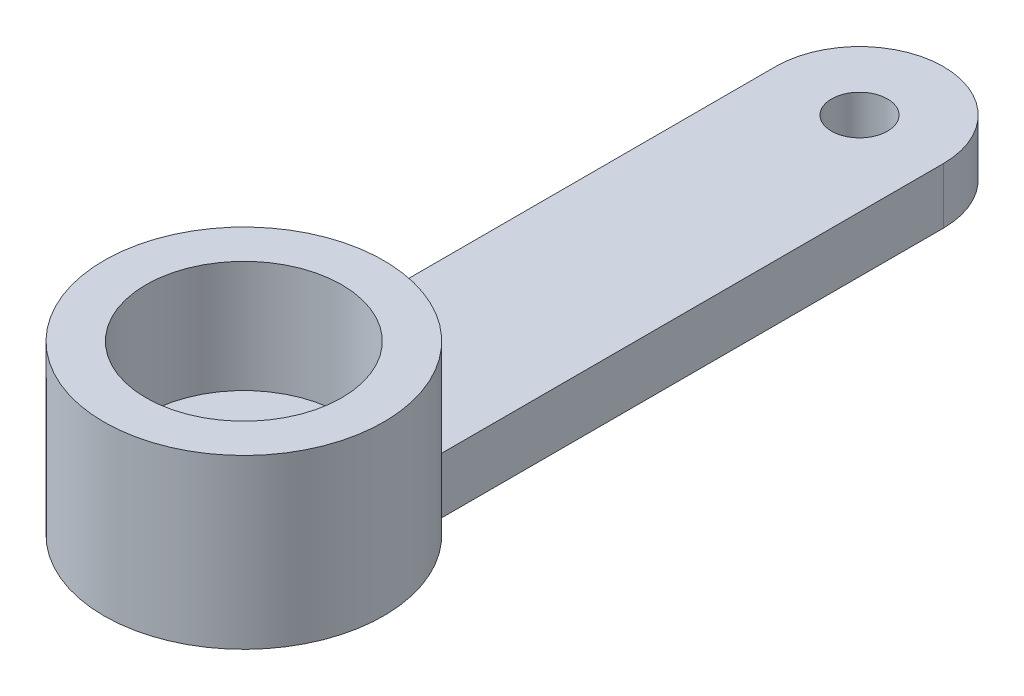
ISO-10303-21;
HEADER;
FILE_DESCRIPTION(('STEP AP214'),'2;1');
FILE_NAME('part.step','',(''),(''),'','','');
FILE_SCHEMA(('AUTOMOTIVE_DESIGN { 1 0 10303 214 1 1 1 1 }'));
ENDSEC;
DATA;
#1=APPLICATION_CONTEXT('core data for automotive mechanical design processes');
#2=APPLICATION_PROTOCOL_DEFINITION('international standard','automotive_design',2000,#1);
#3=PRODUCT_CONTEXT('',#1,'mechanical');
#4=PRODUCT('Part','Part','',(#3));
#5=PRODUCT_RELATED_PRODUCT_CATEGORY('part','',(#4));
#6=PRODUCT_DEFINITION_FORMATION('','',#4);
#7=PRODUCT_DEFINITION_CONTEXT('part definition',#1,'design');
#8=PRODUCT_DEFINITION('design','',#6,#7);
#9=PRODUCT_DEFINITION_SHAPE('','',#8);
#10=(LENGTH_UNIT() NAMED_UNIT(*) SI_UNIT(.MILLI.,.METRE.));
#11=(NAMED_UNIT(*) PLANE_ANGLE_UNIT() SI_UNIT($,.RADIAN.));
#12=(NAMED_UNIT(*) SI_UNIT($,.STERADIAN.) SOLID_ANGLE_UNIT());
#13=UNCERTAINTY_MEASURE_WITH_UNIT(LENGTH_MEASURE(1.E-05),#10,'distance_accuracy_value','');
#14=(GEOMETRIC_REPRESENTATION_CONTEXT(3) GLOBAL_UNCERTAINTY_ASSIGNED_CONTEXT((#13)) GLOBAL_UNIT_ASSIGNED_CONTEXT((#10,
#11,#12)) REPRESENTATION_CONTEXT('',''));
#15=CARTESIAN_POINT('',(0.,0.,0.));
#16=DIRECTION('',(0.,0.,1.));
#17=DIRECTION('',(1.,0.,0.));
#18=AXIS2_PLACEMENT_3D('',#15,#16,#17);
#19=CARTESIAN_POINT('',(0.,1.,-11.));
#20=DIRECTION('',(0.,-1.,0.));
#21=DIRECTION('',(0.,0.,-1.));
#22=AXIS2_PLACEMENT_3D('',#19,#20,#21);
#23=CYLINDRICAL_SURFACE('',#22,1.5);
#24=CARTESIAN_POINT('',(0.,0.,-11.));
#25=DIRECTION('',(0.,1.,0.));
#26=DIRECTION('',(0.,0.,1.));
#27=AXIS2_PLACEMENT_3D('',#24,#25,#26);
#28=CIRCLE('',#27,1.5);
#29=CARTESIAN_POINT('',(-1.5,0.,-11.));
#30=VERTEX_POINT('',#29);
#31=CARTESIAN_POINT('',(1.5,0.,-11.));
#32=VERTEX_POINT('',#31);
#33=EDGE_CURVE('E109',#30,#32,#28,.F.);
#34=ORIENTED_EDGE('',*,*,#33,.F.);
#35=DIRECTION('',(0.,-1.,0.));
#36=VECTOR('',#35,1.);
#37=CARTESIAN_POINT('',(-1.5,1.,-11.));
#38=LINE('',#37,#36);
#39=CARTESIAN_POINT('',(-1.5,1.,-11.));
#40=VERTEX_POINT('',#39);
#41=EDGE_CURVE('E11',#40,#30,#38,.T.);
#42=ORIENTED_EDGE('',*,*,#41,.F.);
#43=CARTESIAN_POINT('',(0.,1.,-11.));
#44=DIRECTION('',(0.,1.,0.));
#45=DIRECTION('',(0.,0.,1.));
#46=AXIS2_PLACEMENT_3D('',#43,#44,#45);
#47=CIRCLE('',#46,1.5);
#48=CARTESIAN_POINT('',(1.5,1.,-11.));
#49=VERTEX_POINT('',#48);
#50=EDGE_CURVE('E116',#40,#49,#47,.F.);
#51=ORIENTED_EDGE('',*,*,#50,.T.);
#52=DIRECTION('',(0.,-1.,0.));
#53=VECTOR('',#52,1.);
#54=CARTESIAN_POINT('',(1.5,1.,-11.));
#55=LINE('',#54,#53);
#56=EDGE_CURVE('E58',#49,#32,#55,.T.);
#57=ORIENTED_EDGE('',*,*,#56,.T.);
#58=EDGE_LOOP('',(#34,#42,#51,#57));
#59=FACE_BOUND('',#58,.T.);
#60=ADVANCED_FACE('F41',(#59),#23,.T.);
#61=CARTESIAN_POINT('',(-1.5,1.,0.));
#62=DIRECTION('',(-1.,0.,0.));
#63=DIRECTION('',(0.,0.,1.));
#64=AXIS2_PLACEMENT_3D('',#61,#62,#63);
#65=PLANE('',#64);
#66=DIRECTION('',(0.,0.,-1.));
#67=VECTOR('',#66,1.);
#68=CARTESIAN_POINT('',(-1.5,0.,0.));
#69=LINE('',#68,#67);
#70=CARTESIAN_POINT('',(-1.5,0.,-2.));
#71=VERTEX_POINT('',#70);
#72=EDGE_CURVE('E124',#71,#30,#69,.T.);
#73=ORIENTED_EDGE('',*,*,#72,.F.);
#74=DIRECTION('',(0.,-1.,0.));
#75=VECTOR('',#74,1.);
#76=CARTESIAN_POINT('',(-1.5,1.,-2.));
#77=LINE('',#76,#75);
#78=CARTESIAN_POINT('',(-1.5,1.,-2.));
#79=VERTEX_POINT('',#78);
#80=EDGE_CURVE('E50',#79,#71,#77,.T.);
#81=ORIENTED_EDGE('',*,*,#80,.F.);
#82=DIRECTION('',(0.,0.,-1.));
#83=VECTOR('',#82,1.);
#84=CARTESIAN_POINT('',(-1.5,1.,0.));
#85=LINE('',#84,#83);
#86=EDGE_CURVE('E87',#79,#40,#85,.T.);
#87=ORIENTED_EDGE('',*,*,#86,.T.);
#88=ORIENTED_EDGE('',*,*,#41,.T.);
#89=EDGE_LOOP('',(#73,#81,#87,#88));
#90=FACE_BOUND('',#89,.T.);
#91=ADVANCED_FACE('F138',(#90),#65,.T.);
#92=CARTESIAN_POINT('',(0.,1.,0.));
#93=DIRECTION('',(0.,-1.,0.));
#94=DIRECTION('',(0.,0.,-1.));
#95=AXIS2_PLACEMENT_3D('',#92,#93,#94);
#96=CYLINDRICAL_SURFACE('',#95,2.5);
#97=CARTESIAN_POINT('',(0.,0.,0.));
#98=DIRECTION('',(0.,1.,0.));
#99=DIRECTION('',(0.,0.,1.));
#100=AXIS2_PLACEMENT_3D('',#97,#98,#99);
#101=CIRCLE('',#100,2.5);
#102=CARTESIAN_POINT('',(1.5,0.,-2.));
#103=VERTEX_POINT('',#102);
#104=EDGE_CURVE('E95',#71,#103,#101,.T.);
#105=ORIENTED_EDGE('',*,*,#104,.T.);
#106=DIRECTION('',(0.,-1.,0.));
#107=VECTOR('',#106,1.);
#108=CARTESIAN_POINT('',(1.5,1.,-2.));
#109=LINE('',#108,#107);
#110=CARTESIAN_POINT('',(1.5,1.,-2.));
#111=VERTEX_POINT('',#110);
#112=EDGE_CURVE('E73',#111,#103,#109,.T.);
#113=ORIENTED_EDGE('',*,*,#112,.F.);
#114=CARTESIAN_POINT('',(0.,1.,0.));
#115=DIRECTION('',(0.,1.,0.));
#116=DIRECTION('',(0.,0.,1.));
#117=AXIS2_PLACEMENT_3D('',#114,#115,#116);
#118=CIRCLE('',#117,2.5);
#119=EDGE_CURVE('E93',#111,#79,#118,.T.);
#120=ORIENTED_EDGE('',*,*,#119,.T.);
#121=ORIENTED_EDGE('',*,*,#80,.T.);
#122=EDGE_LOOP('',(#105,#113,#120,#121));
#123=FACE_BOUND('',#122,.T.);
#124=CARTESIAN_POINT('',(0.,3.,0.));
#125=DIRECTION('',(0.,1.,0.));
#126=DIRECTION('',(0.,0.,1.));
#127=AXIS2_PLACEMENT_3D('',#124,#125,#126);
#128=CIRCLE('',#127,2.5);
#129=CARTESIAN_POINT('',(0.,3.,2.5));
#130=VERTEX_POINT('',#129);
#131=EDGE_CURVE('E103',#130,#130,#128,.T.);
#132=ORIENTED_EDGE('',*,*,#131,.F.);
#133=EDGE_LOOP('',(#132));
#134=FACE_BOUND('',#133,.T.);
#135=ADVANCED_FACE('F91',(#123,#134),#96,.T.);
#136=CARTESIAN_POINT('',(1.5,1.,0.));
#137=DIRECTION('',(1.,0.,0.));
#138=DIRECTION('',(0.,0.,-1.));
#139=AXIS2_PLACEMENT_3D('',#136,#137,#138);
#140=PLANE('',#139);
#141=DIRECTION('',(0.,0.,1.));
#142=VECTOR('',#141,1.);
#143=CARTESIAN_POINT('',(1.5,0.,0.));
#144=LINE('',#143,#142);
#145=EDGE_CURVE('E119',#32,#103,#144,.T.);
#146=ORIENTED_EDGE('',*,*,#145,.F.);
#147=ORIENTED_EDGE('',*,*,#56,.F.);
#148=DIRECTION('',(0.,0.,1.));
#149=VECTOR('',#148,1.);
#150=CARTESIAN_POINT('',(1.5,1.,0.));
#151=LINE('',#150,#149);
#152=EDGE_CURVE('E82',#49,#111,#151,.T.);
#153=ORIENTED_EDGE('',*,*,#152,.T.);
#154=ORIENTED_EDGE('',*,*,#112,.T.);
#155=EDGE_LOOP('',(#146,#147,#153,#154));
#156=FACE_BOUND('',#155,.T.);
#157=ADVANCED_FACE('F83',(#156),#140,.T.);
#158=CARTESIAN_POINT('',(0.,1.,0.));
#159=DIRECTION('',(0.,1.,0.));
#160=DIRECTION('',(0.,0.,1.));
#161=AXIS2_PLACEMENT_3D('',#158,#159,#160);
#162=PLANE('',#161);
#163=CARTESIAN_POINT('',(0.,1.,-11.));
#164=DIRECTION('',(0.,1.,0.));
#165=DIRECTION('',(0.,0.,1.));
#166=AXIS2_PLACEMENT_3D('',#163,#164,#165);
#167=CIRCLE('',#166,0.5);
#168=CARTESIAN_POINT('',(0.,1.,-10.5));
#169=VERTEX_POINT('',#168);
#170=EDGE_CURVE('E175',#169,#169,#167,.T.);
#171=ORIENTED_EDGE('',*,*,#170,.F.);
#172=EDGE_LOOP('',(#171));
#173=FACE_BOUND('',#172,.T.);
#174=ORIENTED_EDGE('',*,*,#119,.F.);
#175=ORIENTED_EDGE('',*,*,#152,.F.);
#176=ORIENTED_EDGE('',*,*,#50,.F.);
#177=ORIENTED_EDGE('',*,*,#86,.F.);
#178=EDGE_LOOP('',(#174,#175,#176,#177));
#179=FACE_BOUND('',#178,.T.);
#180=ADVANCED_FACE('F100',(#173,#179),#162,.T.);
#181=CARTESIAN_POINT('',(0.,0.,0.));
#182=DIRECTION('',(0.,1.,0.));
#183=DIRECTION('',(0.,0.,1.));
#184=AXIS2_PLACEMENT_3D('',#181,#182,#183);
#185=PLANE('',#184);
#186=CARTESIAN_POINT('',(0.,0.,-11.));
#187=DIRECTION('',(0.,-1.,0.));
#188=DIRECTION('',(0.,0.,-1.));
#189=AXIS2_PLACEMENT_3D('',#186,#187,#188);
#190=CIRCLE('',#189,0.5);
#191=CARTESIAN_POINT('',(0.,0.,-11.5));
#192=VERTEX_POINT('',#191);
#193=EDGE_CURVE('E178',#192,#192,#190,.T.);
#194=ORIENTED_EDGE('',*,*,#193,.F.);
#195=EDGE_LOOP('',(#194));
#196=FACE_BOUND('',#195,.T.);
#197=ORIENTED_EDGE('',*,*,#33,.T.);
#198=ORIENTED_EDGE('',*,*,#145,.T.);
#199=ORIENTED_EDGE('',*,*,#104,.F.);
#200=ORIENTED_EDGE('',*,*,#72,.T.);
#201=EDGE_LOOP('',(#197,#198,#199,#200));
#202=FACE_BOUND('',#201,.T.);
#203=ADVANCED_FACE('F137',(#196,#202),#185,.F.);
#204=CARTESIAN_POINT('',(0.,3.,0.));
#205=DIRECTION('',(0.,1.,0.));
#206=DIRECTION('',(0.,0.,1.));
#207=AXIS2_PLACEMENT_3D('',#204,#205,#206);
#208=PLANE('',#207);
#209=ORIENTED_EDGE('',*,*,#131,.T.);
#210=EDGE_LOOP('',(#209));
#211=FACE_BOUND('',#210,.T.);
#212=CARTESIAN_POINT('',(0.,3.,0.));
#213=DIRECTION('',(0.,1.,0.));
#214=DIRECTION('',(0.,0.,1.));
#215=AXIS2_PLACEMENT_3D('',#212,#213,#214);
#216=CIRCLE('',#215,1.75);
#217=CARTESIAN_POINT('',(0.,3.,1.75));
#218=VERTEX_POINT('',#217);
#219=EDGE_CURVE('E104',#218,#218,#216,.T.);
#220=ORIENTED_EDGE('',*,*,#219,.F.);
#221=EDGE_LOOP('',(#220));
#222=FACE_BOUND('',#221,.T.);
#223=ADVANCED_FACE('F152',(#211,#222),#208,.T.);
#224=CARTESIAN_POINT('',(0.,3.,0.));
#225=DIRECTION('',(0.,-1.,0.));
#226=DIRECTION('',(0.,0.,-1.));
#227=AXIS2_PLACEMENT_3D('',#224,#225,#226);
#228=CYLINDRICAL_SURFACE('',#227,1.75);
#229=ORIENTED_EDGE('',*,*,#219,.T.);
#230=EDGE_LOOP('',(#229));
#231=FACE_BOUND('',#230,.T.);
#232=CARTESIAN_POINT('',(0.,1.,0.));
#233=DIRECTION('',(0.,1.,0.));
#234=DIRECTION('',(0.,0.,1.));
#235=AXIS2_PLACEMENT_3D('',#232,#233,#234);
#236=CIRCLE('',#235,1.75);
#237=CARTESIAN_POINT('',(0.,1.,1.75));
#238=VERTEX_POINT('',#237);
#239=EDGE_CURVE('E112',#238,#238,#236,.T.);
#240=ORIENTED_EDGE('',*,*,#239,.F.);
#241=EDGE_LOOP('',(#240));
#242=FACE_BOUND('',#241,.T.);
#243=ADVANCED_FACE('F160',(#231,#242),#228,.F.);
#244=ORIENTED_EDGE('',*,*,#239,.T.);
#245=EDGE_LOOP('',(#244));
#246=FACE_BOUND('',#245,.T.);
#247=ADVANCED_FACE('F157',(#246),#162,.T.);
#248=CARTESIAN_POINT('',(0.,2.,-11.));
#249=DIRECTION('',(0.,-1.,0.));
#250=DIRECTION('',(0.,0.,-1.));
#251=AXIS2_PLACEMENT_3D('',#248,#249,#250);
#252=CYLINDRICAL_SURFACE('',#251,0.5);
#253=ORIENTED_EDGE('',*,*,#170,.T.);
#254=EDGE_LOOP('',(#253));
#255=FACE_BOUND('',#254,.T.);
#256=ORIENTED_EDGE('',*,*,#193,.T.);
#257=EDGE_LOOP('',(#256));
#258=FACE_BOUND('',#257,.T.);
#259=ADVANCED_FACE('F165',(#255,#258),#252,.F.);
#260=CLOSED_SHELL('',(#60,#91,#135,#157,#180,#203,#223,#243,#247,#259));
#261=MANIFOLD_SOLID_BREP('B2',#260);
#262=ADVANCED_BREP_SHAPE_REPRESENTATION('',(#18,#261),#14);
#263=SHAPE_DEFINITION_REPRESENTATION(#9,#262);
ENDSEC;
END-ISO-10303-21;
